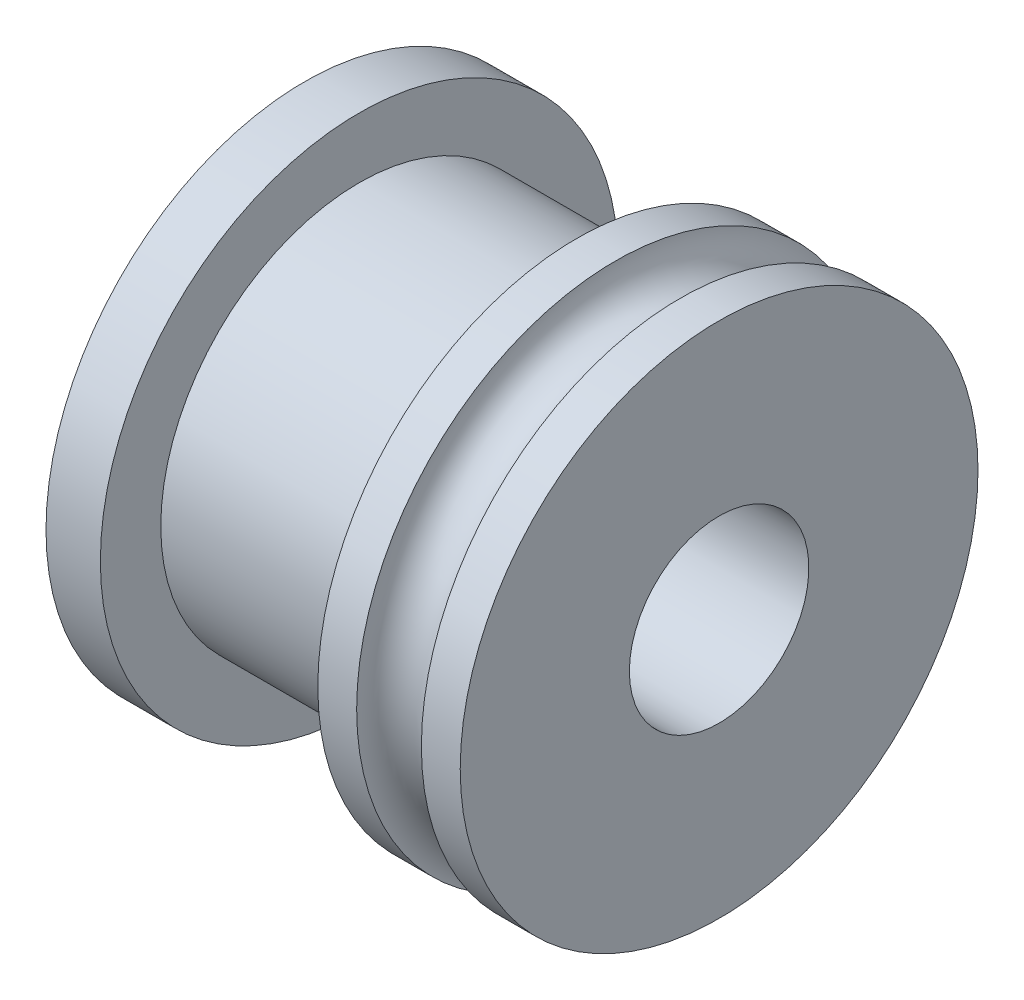
ISO-10303-21;
HEADER;
FILE_DESCRIPTION(('STEP AP214'),'2;1');
FILE_NAME('part.step','',(''),(''),'','','');
FILE_SCHEMA(('AUTOMOTIVE_DESIGN { 1 0 10303 214 1 1 1 1 }'));
ENDSEC;
DATA;
#1=APPLICATION_CONTEXT('core data for automotive mechanical design processes');
#2=APPLICATION_PROTOCOL_DEFINITION('international standard','automotive_design',2000,#1);
#3=PRODUCT_CONTEXT('',#1,'mechanical');
#4=PRODUCT('Part','Part','',(#3));
#5=PRODUCT_RELATED_PRODUCT_CATEGORY('part','',(#4));
#6=PRODUCT_DEFINITION_FORMATION('','',#4);
#7=PRODUCT_DEFINITION_CONTEXT('part definition',#1,'design');
#8=PRODUCT_DEFINITION('design','',#6,#7);
#9=PRODUCT_DEFINITION_SHAPE('','',#8);
#10=(LENGTH_UNIT() NAMED_UNIT(*) SI_UNIT(.MILLI.,.METRE.));
#11=(NAMED_UNIT(*) PLANE_ANGLE_UNIT() SI_UNIT($,.RADIAN.));
#12=(NAMED_UNIT(*) SI_UNIT($,.STERADIAN.) SOLID_ANGLE_UNIT());
#13=UNCERTAINTY_MEASURE_WITH_UNIT(LENGTH_MEASURE(1.E-05),#10,'distance_accuracy_value','');
#14=(GEOMETRIC_REPRESENTATION_CONTEXT(3) GLOBAL_UNCERTAINTY_ASSIGNED_CONTEXT((#13)) GLOBAL_UNIT_ASSIGNED_CONTEXT((#10,
#11,#12)) REPRESENTATION_CONTEXT('',''));
#15=CARTESIAN_POINT('',(0.,0.,0.));
#16=DIRECTION('',(0.,0.,1.));
#17=DIRECTION('',(1.,0.,0.));
#18=AXIS2_PLACEMENT_3D('',#15,#16,#17);
#19=CARTESIAN_POINT('',(0.,9.525,0.));
#20=DIRECTION('',(1.,0.,0.));
#21=DIRECTION('',(0.,0.,-1.));
#22=AXIS2_PLACEMENT_3D('',#19,#20,#21);
#23=PLANE('',#22);
#24=CARTESIAN_POINT('',(0.,0.,0.));
#25=DIRECTION('',(-1.,0.,0.));
#26=DIRECTION('',(0.,0.,1.));
#27=AXIS2_PLACEMENT_3D('',#24,#25,#26);
#28=CIRCLE('',#27,3.302);
#29=CARTESIAN_POINT('',(0.,0.,3.302));
#30=VERTEX_POINT('',#29);
#31=EDGE_CURVE('E12',#30,#30,#28,.T.);
#32=ORIENTED_EDGE('',*,*,#31,.F.);
#33=EDGE_LOOP('',(#32));
#34=FACE_BOUND('',#33,.T.);
#35=CARTESIAN_POINT('',(0.,0.,0.));
#36=DIRECTION('',(-1.,0.,0.));
#37=DIRECTION('',(0.,0.,1.));
#38=AXIS2_PLACEMENT_3D('',#35,#36,#37);
#39=CIRCLE('',#38,9.525);
#40=CARTESIAN_POINT('',(0.,0.,9.525));
#41=VERTEX_POINT('',#40);
#42=EDGE_CURVE('E75',#41,#41,#39,.T.);
#43=ORIENTED_EDGE('',*,*,#42,.T.);
#44=EDGE_LOOP('',(#43));
#45=FACE_BOUND('',#44,.T.);
#46=ADVANCED_FACE('F41',(#34,#45),#23,.F.);
#47=CARTESIAN_POINT('',(0.,0.,0.));
#48=DIRECTION('',(-1.,0.,0.));
#49=DIRECTION('',(0.,0.,1.));
#50=AXIS2_PLACEMENT_3D('',#47,#48,#49);
#51=CYLINDRICAL_SURFACE('',#50,3.302);
#52=CARTESIAN_POINT('',(15.24,0.,0.));
#53=DIRECTION('',(-1.,0.,0.));
#54=DIRECTION('',(0.,0.,1.));
#55=AXIS2_PLACEMENT_3D('',#52,#53,#54);
#56=CIRCLE('',#55,3.302);
#57=CARTESIAN_POINT('',(15.24,0.,3.302));
#58=VERTEX_POINT('',#57);
#59=EDGE_CURVE('E47',#58,#58,#56,.T.);
#60=ORIENTED_EDGE('',*,*,#59,.F.);
#61=EDGE_LOOP('',(#60));
#62=FACE_BOUND('',#61,.T.);
#63=ORIENTED_EDGE('',*,*,#31,.T.);
#64=EDGE_LOOP('',(#63));
#65=FACE_BOUND('',#64,.T.);
#66=ADVANCED_FACE('F124',(#62,#65),#51,.F.);
#67=CARTESIAN_POINT('',(15.24,3.302,0.));
#68=DIRECTION('',(-1.,0.,0.));
#69=DIRECTION('',(0.,0.,1.));
#70=AXIS2_PLACEMENT_3D('',#67,#68,#69);
#71=PLANE('',#70);
#72=CARTESIAN_POINT('',(15.24,0.,0.));
#73=DIRECTION('',(-1.,0.,0.));
#74=DIRECTION('',(0.,0.,1.));
#75=AXIS2_PLACEMENT_3D('',#72,#73,#74);
#76=CIRCLE('',#75,9.525);
#77=CARTESIAN_POINT('',(15.24,0.,9.525));
#78=VERTEX_POINT('',#77);
#79=EDGE_CURVE('E51',#78,#78,#76,.T.);
#80=ORIENTED_EDGE('',*,*,#79,.F.);
#81=EDGE_LOOP('',(#80));
#82=FACE_BOUND('',#81,.T.);
#83=ORIENTED_EDGE('',*,*,#59,.T.);
#84=EDGE_LOOP('',(#83));
#85=FACE_BOUND('',#84,.T.);
#86=ADVANCED_FACE('F119',(#82,#85),#71,.F.);
#87=CARTESIAN_POINT('',(0.,0.,0.));
#88=DIRECTION('',(-1.,0.,0.));
#89=DIRECTION('',(0.,0.,1.));
#90=AXIS2_PLACEMENT_3D('',#87,#88,#89);
#91=CYLINDRICAL_SURFACE('',#90,9.525);
#92=CARTESIAN_POINT('',(13.810625,0.,0.));
#93=DIRECTION('',(-1.,0.,0.));
#94=DIRECTION('',(0.,0.,1.));
#95=AXIS2_PLACEMENT_3D('',#92,#93,#94);
#96=CIRCLE('',#95,9.525);
#97=CARTESIAN_POINT('',(13.810625,0.,9.525));
#98=VERTEX_POINT('',#97);
#99=EDGE_CURVE('E55',#98,#98,#96,.T.);
#100=ORIENTED_EDGE('',*,*,#99,.F.);
#101=EDGE_LOOP('',(#100));
#102=FACE_BOUND('',#101,.T.);
#103=ORIENTED_EDGE('',*,*,#79,.T.);
#104=EDGE_LOOP('',(#103));
#105=FACE_BOUND('',#104,.T.);
#106=ADVANCED_FACE('F113',(#102,#105),#91,.T.);
#107=CARTESIAN_POINT('',(12.62,0.,0.));
#108=DIRECTION('',(-1.,0.,0.));
#109=DIRECTION('',(0.,0.,1.));
#110=AXIS2_PLACEMENT_3D('',#107,#108,#109);
#111=TOROIDAL_SURFACE('',#110,9.525,1.190625);
#112=CARTESIAN_POINT('',(11.429375,0.,0.));
#113=DIRECTION('',(-1.,0.,0.));
#114=DIRECTION('',(0.,0.,1.));
#115=AXIS2_PLACEMENT_3D('',#112,#113,#114);
#116=CIRCLE('',#115,9.525);
#117=CARTESIAN_POINT('',(11.429375,0.,9.525));
#118=VERTEX_POINT('',#117);
#119=EDGE_CURVE('E60',#118,#118,#116,.T.);
#120=ORIENTED_EDGE('',*,*,#119,.F.);
#121=EDGE_LOOP('',(#120));
#122=FACE_BOUND('',#121,.T.);
#123=ORIENTED_EDGE('',*,*,#99,.T.);
#124=EDGE_LOOP('',(#123));
#125=FACE_BOUND('',#124,.T.);
#126=ADVANCED_FACE('F107',(#122,#125),#111,.F.);
#127=CARTESIAN_POINT('',(0.,0.,0.));
#128=DIRECTION('',(-1.,0.,0.));
#129=DIRECTION('',(0.,0.,1.));
#130=AXIS2_PLACEMENT_3D('',#127,#128,#129);
#131=CYLINDRICAL_SURFACE('',#130,9.525);
#132=CARTESIAN_POINT('',(10.,0.,0.));
#133=DIRECTION('',(-1.,0.,0.));
#134=DIRECTION('',(0.,0.,1.));
#135=AXIS2_PLACEMENT_3D('',#132,#133,#134);
#136=CIRCLE('',#135,9.525);
#137=CARTESIAN_POINT('',(10.,0.,9.525));
#138=VERTEX_POINT('',#137);
#139=EDGE_CURVE('E63',#138,#138,#136,.T.);
#140=ORIENTED_EDGE('',*,*,#139,.F.);
#141=EDGE_LOOP('',(#140));
#142=FACE_BOUND('',#141,.T.);
#143=ORIENTED_EDGE('',*,*,#119,.T.);
#144=EDGE_LOOP('',(#143));
#145=FACE_BOUND('',#144,.T.);
#146=ADVANCED_FACE('F101',(#142,#145),#131,.T.);
#147=CARTESIAN_POINT('',(10.,9.525,0.));
#148=DIRECTION('',(1.,0.,0.));
#149=DIRECTION('',(0.,0.,-1.));
#150=AXIS2_PLACEMENT_3D('',#147,#148,#149);
#151=PLANE('',#150);
#152=CARTESIAN_POINT('',(10.,0.,0.));
#153=DIRECTION('',(-1.,0.,0.));
#154=DIRECTION('',(0.,0.,1.));
#155=AXIS2_PLACEMENT_3D('',#152,#153,#154);
#156=CIRCLE('',#155,7.302);
#157=CARTESIAN_POINT('',(10.,0.,7.302));
#158=VERTEX_POINT('',#157);
#159=EDGE_CURVE('E66',#158,#158,#156,.T.);
#160=ORIENTED_EDGE('',*,*,#159,.F.);
#161=EDGE_LOOP('',(#160));
#162=FACE_BOUND('',#161,.T.);
#163=ORIENTED_EDGE('',*,*,#139,.T.);
#164=EDGE_LOOP('',(#163));
#165=FACE_BOUND('',#164,.T.);
#166=ADVANCED_FACE('F95',(#162,#165),#151,.F.);
#167=CARTESIAN_POINT('',(0.,0.,0.));
#168=DIRECTION('',(-1.,0.,0.));
#169=DIRECTION('',(0.,0.,1.));
#170=AXIS2_PLACEMENT_3D('',#167,#168,#169);
#171=CYLINDRICAL_SURFACE('',#170,7.302);
#172=CARTESIAN_POINT('',(2.,0.,0.));
#173=DIRECTION('',(-1.,0.,0.));
#174=DIRECTION('',(0.,0.,1.));
#175=AXIS2_PLACEMENT_3D('',#172,#173,#174);
#176=CIRCLE('',#175,7.302);
#177=CARTESIAN_POINT('',(2.,0.,7.302));
#178=VERTEX_POINT('',#177);
#179=EDGE_CURVE('E69',#178,#178,#176,.T.);
#180=ORIENTED_EDGE('',*,*,#179,.F.);
#181=EDGE_LOOP('',(#180));
#182=FACE_BOUND('',#181,.T.);
#183=ORIENTED_EDGE('',*,*,#159,.T.);
#184=EDGE_LOOP('',(#183));
#185=FACE_BOUND('',#184,.T.);
#186=ADVANCED_FACE('F89',(#182,#185),#171,.T.);
#187=CARTESIAN_POINT('',(2.,7.302,0.));
#188=DIRECTION('',(-1.,0.,0.));
#189=DIRECTION('',(0.,0.,1.));
#190=AXIS2_PLACEMENT_3D('',#187,#188,#189);
#191=PLANE('',#190);
#192=CARTESIAN_POINT('',(2.,0.,0.));
#193=DIRECTION('',(-1.,0.,0.));
#194=DIRECTION('',(0.,0.,1.));
#195=AXIS2_PLACEMENT_3D('',#192,#193,#194);
#196=CIRCLE('',#195,9.525);
#197=CARTESIAN_POINT('',(2.,0.,9.525));
#198=VERTEX_POINT('',#197);
#199=EDGE_CURVE('E72',#198,#198,#196,.T.);
#200=ORIENTED_EDGE('',*,*,#199,.F.);
#201=EDGE_LOOP('',(#200));
#202=FACE_BOUND('',#201,.T.);
#203=ORIENTED_EDGE('',*,*,#179,.T.);
#204=EDGE_LOOP('',(#203));
#205=FACE_BOUND('',#204,.T.);
#206=ADVANCED_FACE('F83',(#202,#205),#191,.F.);
#207=CARTESIAN_POINT('',(0.,0.,0.));
#208=DIRECTION('',(-1.,0.,0.));
#209=DIRECTION('',(0.,0.,1.));
#210=AXIS2_PLACEMENT_3D('',#207,#208,#209);
#211=CYLINDRICAL_SURFACE('',#210,9.525);
#212=ORIENTED_EDGE('',*,*,#42,.F.);
#213=EDGE_LOOP('',(#212));
#214=FACE_BOUND('',#213,.T.);
#215=ORIENTED_EDGE('',*,*,#199,.T.);
#216=EDGE_LOOP('',(#215));
#217=FACE_BOUND('',#216,.T.);
#218=ADVANCED_FACE('F80',(#214,#217),#211,.T.);
#219=CLOSED_SHELL('',(#46,#66,#86,#106,#126,#146,#166,#186,#206,#218));
#220=MANIFOLD_SOLID_BREP('B2',#219);
#221=ADVANCED_BREP_SHAPE_REPRESENTATION('',(#18,#220),#14);
#222=SHAPE_DEFINITION_REPRESENTATION(#9,#221);
ENDSEC;
END-ISO-10303-21;
